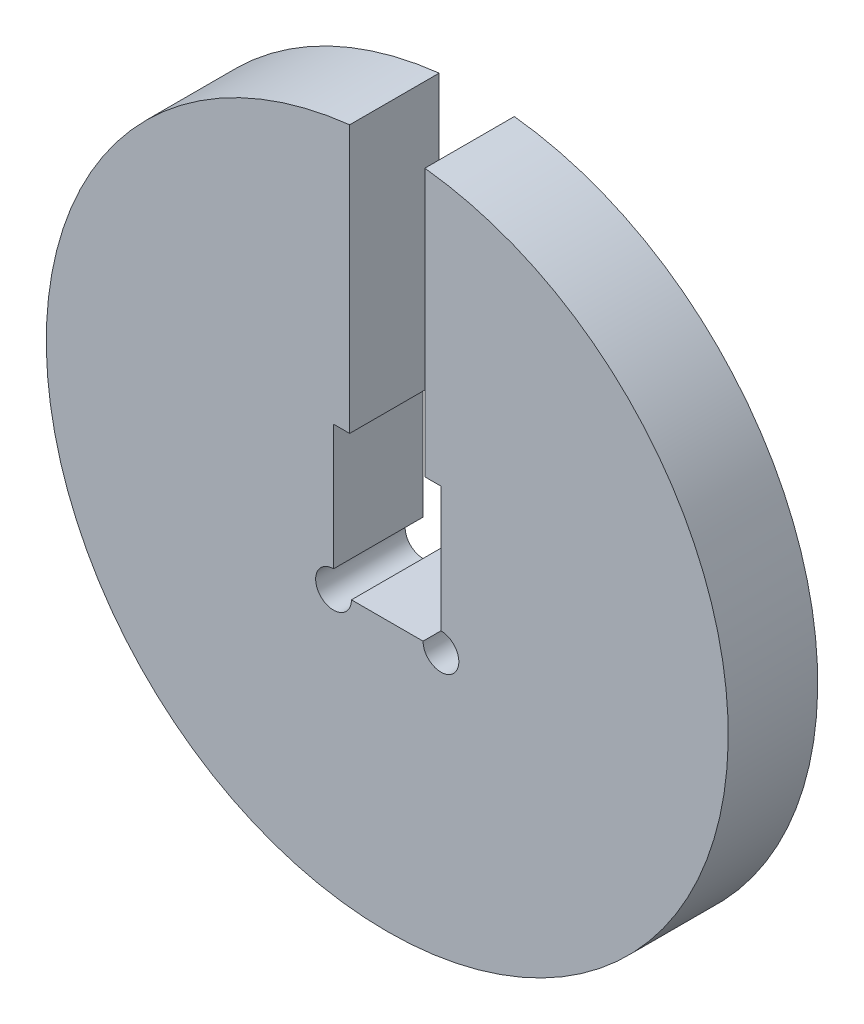
ISO-10303-21;
HEADER;
FILE_DESCRIPTION(('STEP AP214'),'2;1');
FILE_NAME('part.step','',(''),(''),'','','');
FILE_SCHEMA(('AUTOMOTIVE_DESIGN { 1 0 10303 214 1 1 1 1 }'));
ENDSEC;
DATA;
#1=APPLICATION_CONTEXT('core data for automotive mechanical design processes');
#2=APPLICATION_PROTOCOL_DEFINITION('international standard','automotive_design',2000,#1);
#3=PRODUCT_CONTEXT('',#1,'mechanical');
#4=PRODUCT('Part','Part','',(#3));
#5=PRODUCT_RELATED_PRODUCT_CATEGORY('part','',(#4));
#6=PRODUCT_DEFINITION_FORMATION('','',#4);
#7=PRODUCT_DEFINITION_CONTEXT('part definition',#1,'design');
#8=PRODUCT_DEFINITION('design','',#6,#7);
#9=PRODUCT_DEFINITION_SHAPE('','',#8);
#10=(LENGTH_UNIT() NAMED_UNIT(*) SI_UNIT(.MILLI.,.METRE.));
#11=(NAMED_UNIT(*) PLANE_ANGLE_UNIT() SI_UNIT($,.RADIAN.));
#12=(NAMED_UNIT(*) SI_UNIT($,.STERADIAN.) SOLID_ANGLE_UNIT());
#13=UNCERTAINTY_MEASURE_WITH_UNIT(LENGTH_MEASURE(1.E-05),#10,'distance_accuracy_value','');
#14=(GEOMETRIC_REPRESENTATION_CONTEXT(3) GLOBAL_UNCERTAINTY_ASSIGNED_CONTEXT((#13)) GLOBAL_UNIT_ASSIGNED_CONTEXT((#10,
#11,#12)) REPRESENTATION_CONTEXT('',''));
#15=CARTESIAN_POINT('',(0.,0.,0.));
#16=DIRECTION('',(0.,0.,1.));
#17=DIRECTION('',(1.,0.,0.));
#18=AXIS2_PLACEMENT_3D('',#15,#16,#17);
#19=CARTESIAN_POINT('',(-1.5,2.,2.5));
#20=DIRECTION('',(0.,-1.,0.));
#21=DIRECTION('',(0.,0.,-1.));
#22=AXIS2_PLACEMENT_3D('',#19,#20,#21);
#23=PLANE('',#22);
#24=DIRECTION('',(0.,0.,1.));
#25=VECTOR('',#24,1.);
#26=CARTESIAN_POINT('',(-1.05,2.,0.));
#27=LINE('',#26,#25);
#28=CARTESIAN_POINT('',(-1.05,2.,0.));
#29=VERTEX_POINT('',#28);
#30=CARTESIAN_POINT('',(-1.05,2.,2.5));
#31=VERTEX_POINT('',#30);
#32=EDGE_CURVE('E178',#29,#31,#27,.T.);
#33=ORIENTED_EDGE('',*,*,#32,.T.);
#34=DIRECTION('',(-1.,0.,0.));
#35=VECTOR('',#34,1.);
#36=CARTESIAN_POINT('',(-1.5,2.,2.5));
#37=LINE('',#36,#35);
#38=CARTESIAN_POINT('',(-1.5,2.,2.5));
#39=VERTEX_POINT('',#38);
#40=EDGE_CURVE('E126',#31,#39,#37,.T.);
#41=ORIENTED_EDGE('',*,*,#40,.T.);
#42=DIRECTION('',(0.,0.,-1.));
#43=VECTOR('',#42,1.);
#44=CARTESIAN_POINT('',(-1.5,2.,2.5));
#45=LINE('',#44,#43);
#46=CARTESIAN_POINT('',(-1.5,2.,0.));
#47=VERTEX_POINT('',#46);
#48=EDGE_CURVE('E136',#39,#47,#45,.T.);
#49=ORIENTED_EDGE('',*,*,#48,.T.);
#50=DIRECTION('',(-1.,0.,0.));
#51=VECTOR('',#50,1.);
#52=CARTESIAN_POINT('',(-1.5,2.,0.));
#53=LINE('',#52,#51);
#54=EDGE_CURVE('E145',#29,#47,#53,.T.);
#55=ORIENTED_EDGE('',*,*,#54,.F.);
#56=EDGE_LOOP('',(#33,#41,#49,#55));
#57=FACE_BOUND('',#56,.T.);
#58=ADVANCED_FACE('F32',(#57),#23,.T.);
#59=CARTESIAN_POINT('',(0.,0.,2.5));
#60=DIRECTION('',(0.,0.,1.));
#61=DIRECTION('',(1.,0.,0.));
#62=AXIS2_PLACEMENT_3D('',#59,#60,#61);
#63=PLANE('',#62);
#64=CARTESIAN_POINT('',(1.5,-2.,2.5));
#65=DIRECTION('',(0.,0.,1.));
#66=DIRECTION('',(1.,0.,0.));
#67=AXIS2_PLACEMENT_3D('',#64,#65,#66);
#68=CIRCLE('',#67,0.5);
#69=CARTESIAN_POINT('',(1.,-2.,2.5));
#70=VERTEX_POINT('',#69);
#71=CARTESIAN_POINT('',(1.5,-1.5,2.5));
#72=VERTEX_POINT('',#71);
#73=EDGE_CURVE('E46',#70,#72,#68,.T.);
#74=ORIENTED_EDGE('',*,*,#73,.F.);
#75=DIRECTION('',(1.,0.,0.));
#76=VECTOR('',#75,1.);
#77=CARTESIAN_POINT('',(-1.5,-2.,2.5));
#78=LINE('',#77,#76);
#79=CARTESIAN_POINT('',(-1.,-2.,2.5));
#80=VERTEX_POINT('',#79);
#81=EDGE_CURVE('E119',#80,#70,#78,.T.);
#82=ORIENTED_EDGE('',*,*,#81,.F.);
#83=CARTESIAN_POINT('',(-1.5,-2.,2.5));
#84=DIRECTION('',(0.,0.,1.));
#85=DIRECTION('',(1.,0.,0.));
#86=AXIS2_PLACEMENT_3D('',#83,#84,#85);
#87=CIRCLE('',#86,0.5);
#88=CARTESIAN_POINT('',(-1.5,-1.5,2.5));
#89=VERTEX_POINT('',#88);
#90=EDGE_CURVE('E54',#89,#80,#87,.T.);
#91=ORIENTED_EDGE('',*,*,#90,.F.);
#92=DIRECTION('',(0.,-1.,0.));
#93=VECTOR('',#92,1.);
#94=CARTESIAN_POINT('',(-1.5,2.,2.5));
#95=LINE('',#94,#93);
#96=EDGE_CURVE('E124',#39,#89,#95,.T.);
#97=ORIENTED_EDGE('',*,*,#96,.F.);
#98=ORIENTED_EDGE('',*,*,#40,.F.);
#99=DIRECTION('',(0.,-1.,0.));
#100=VECTOR('',#99,1.);
#101=CARTESIAN_POINT('',(-1.05,2.,2.5));
#102=LINE('',#101,#100);
#103=CARTESIAN_POINT('',(-1.05,9.46694908616287,2.5));
#104=VERTEX_POINT('',#103);
#105=EDGE_CURVE('E167',#104,#31,#102,.T.);
#106=ORIENTED_EDGE('',*,*,#105,.F.);
#107=CARTESIAN_POINT('',(0.,0.,2.5));
#108=DIRECTION('',(0.,0.,1.));
#109=DIRECTION('',(1.,0.,0.));
#110=AXIS2_PLACEMENT_3D('',#107,#108,#109);
#111=CIRCLE('',#110,9.525);
#112=CARTESIAN_POINT('',(1.05,9.46694908616287,2.5));
#113=VERTEX_POINT('',#112);
#114=EDGE_CURVE('E154',#104,#113,#111,.T.);
#115=ORIENTED_EDGE('',*,*,#114,.T.);
#116=DIRECTION('',(0.,1.,0.));
#117=VECTOR('',#116,1.);
#118=CARTESIAN_POINT('',(1.05,2.,2.5));
#119=LINE('',#118,#117);
#120=CARTESIAN_POINT('',(1.05,2.,2.5));
#121=VERTEX_POINT('',#120);
#122=EDGE_CURVE('E175',#121,#113,#119,.T.);
#123=ORIENTED_EDGE('',*,*,#122,.F.);
#124=CARTESIAN_POINT('',(1.5,2.,2.5));
#125=VERTEX_POINT('',#124);
#126=EDGE_CURVE('E133',#125,#121,#37,.T.);
#127=ORIENTED_EDGE('',*,*,#126,.F.);
#128=DIRECTION('',(0.,1.,0.));
#129=VECTOR('',#128,1.);
#130=CARTESIAN_POINT('',(1.5,2.,2.5));
#131=LINE('',#130,#129);
#132=EDGE_CURVE('E121',#72,#125,#131,.T.);
#133=ORIENTED_EDGE('',*,*,#132,.F.);
#134=EDGE_LOOP('',(#74,#82,#91,#97,#98,#106,#115,#123,#127,#133));
#135=FACE_BOUND('',#134,.T.);
#136=ADVANCED_FACE('F118',(#135),#63,.T.);
#137=CARTESIAN_POINT('',(0.,0.,0.));
#138=DIRECTION('',(0.,0.,1.));
#139=DIRECTION('',(1.,0.,0.));
#140=AXIS2_PLACEMENT_3D('',#137,#138,#139);
#141=PLANE('',#140);
#142=DIRECTION('',(1.,0.,0.));
#143=VECTOR('',#142,1.);
#144=CARTESIAN_POINT('',(-1.5,-2.,0.));
#145=LINE('',#144,#143);
#146=CARTESIAN_POINT('',(-1.,-2.,0.));
#147=VERTEX_POINT('',#146);
#148=CARTESIAN_POINT('',(1.,-2.,0.));
#149=VERTEX_POINT('',#148);
#150=EDGE_CURVE('E140',#147,#149,#145,.T.);
#151=ORIENTED_EDGE('',*,*,#150,.T.);
#152=CARTESIAN_POINT('',(1.5,-2.,0.));
#153=DIRECTION('',(0.,0.,1.));
#154=DIRECTION('',(1.,0.,0.));
#155=AXIS2_PLACEMENT_3D('',#152,#153,#154);
#156=CIRCLE('',#155,0.5);
#157=CARTESIAN_POINT('',(1.5,-1.5,0.));
#158=VERTEX_POINT('',#157);
#159=EDGE_CURVE('E109',#149,#158,#156,.T.);
#160=ORIENTED_EDGE('',*,*,#159,.T.);
#161=DIRECTION('',(0.,1.,0.));
#162=VECTOR('',#161,1.);
#163=CARTESIAN_POINT('',(1.5,2.,0.));
#164=LINE('',#163,#162);
#165=CARTESIAN_POINT('',(1.5,2.,0.));
#166=VERTEX_POINT('',#165);
#167=EDGE_CURVE('E143',#158,#166,#164,.T.);
#168=ORIENTED_EDGE('',*,*,#167,.T.);
#169=CARTESIAN_POINT('',(1.05,2.,0.));
#170=VERTEX_POINT('',#169);
#171=EDGE_CURVE('E129',#166,#170,#53,.T.);
#172=ORIENTED_EDGE('',*,*,#171,.T.);
#173=DIRECTION('',(0.,1.,0.));
#174=VECTOR('',#173,1.);
#175=CARTESIAN_POINT('',(1.05,2.,0.));
#176=LINE('',#175,#174);
#177=CARTESIAN_POINT('',(1.05,9.46694908616287,0.));
#178=VERTEX_POINT('',#177);
#179=EDGE_CURVE('E174',#170,#178,#176,.T.);
#180=ORIENTED_EDGE('',*,*,#179,.T.);
#181=CARTESIAN_POINT('',(0.,0.,0.));
#182=DIRECTION('',(0.,0.,1.));
#183=DIRECTION('',(1.,0.,0.));
#184=AXIS2_PLACEMENT_3D('',#181,#182,#183);
#185=CIRCLE('',#184,9.525);
#186=CARTESIAN_POINT('',(-1.05,9.46694908616287,0.));
#187=VERTEX_POINT('',#186);
#188=EDGE_CURVE('E153',#187,#178,#185,.T.);
#189=ORIENTED_EDGE('',*,*,#188,.F.);
#190=DIRECTION('',(0.,-1.,0.));
#191=VECTOR('',#190,1.);
#192=CARTESIAN_POINT('',(-1.05,2.,0.));
#193=LINE('',#192,#191);
#194=EDGE_CURVE('E171',#187,#29,#193,.T.);
#195=ORIENTED_EDGE('',*,*,#194,.T.);
#196=ORIENTED_EDGE('',*,*,#54,.T.);
#197=DIRECTION('',(0.,-1.,0.));
#198=VECTOR('',#197,1.);
#199=CARTESIAN_POINT('',(-1.5,2.,0.));
#200=LINE('',#199,#198);
#201=CARTESIAN_POINT('',(-1.5,-1.5,0.));
#202=VERTEX_POINT('',#201);
#203=EDGE_CURVE('E137',#47,#202,#200,.T.);
#204=ORIENTED_EDGE('',*,*,#203,.T.);
#205=CARTESIAN_POINT('',(-1.5,-2.,0.));
#206=DIRECTION('',(0.,0.,1.));
#207=DIRECTION('',(1.,0.,0.));
#208=AXIS2_PLACEMENT_3D('',#205,#206,#207);
#209=CIRCLE('',#208,0.5);
#210=EDGE_CURVE('E160',#202,#147,#209,.T.);
#211=ORIENTED_EDGE('',*,*,#210,.T.);
#212=EDGE_LOOP('',(#151,#160,#168,#172,#180,#189,#195,#196,#204,#211));
#213=FACE_BOUND('',#212,.T.);
#214=ADVANCED_FACE('F163',(#213),#141,.F.);
#215=CARTESIAN_POINT('',(0.,0.,2.5));
#216=DIRECTION('',(0.,0.,-1.));
#217=DIRECTION('',(-1.,0.,0.));
#218=AXIS2_PLACEMENT_3D('',#215,#216,#217);
#219=CYLINDRICAL_SURFACE('',#218,9.525);
#220=ORIENTED_EDGE('',*,*,#114,.F.);
#221=DIRECTION('',(0.,0.,-1.));
#222=VECTOR('',#221,1.);
#223=CARTESIAN_POINT('',(-1.05,9.46694908616287,2.5));
#224=LINE('',#223,#222);
#225=EDGE_CURVE('E141',#104,#187,#224,.T.);
#226=ORIENTED_EDGE('',*,*,#225,.T.);
#227=ORIENTED_EDGE('',*,*,#188,.T.);
#228=DIRECTION('',(0.,0.,-1.));
#229=VECTOR('',#228,1.);
#230=CARTESIAN_POINT('',(1.05,9.46694908616287,2.5));
#231=LINE('',#230,#229);
#232=EDGE_CURVE('E183',#178,#113,#231,.F.);
#233=ORIENTED_EDGE('',*,*,#232,.T.);
#234=EDGE_LOOP('',(#220,#226,#227,#233));
#235=FACE_BOUND('',#234,.T.);
#236=ADVANCED_FACE('F34',(#235),#219,.T.);
#237=CARTESIAN_POINT('',(-1.5,2.,2.5));
#238=DIRECTION('',(1.,0.,0.));
#239=DIRECTION('',(0.,1.,0.));
#240=AXIS2_PLACEMENT_3D('',#237,#238,#239);
#241=PLANE('',#240);
#242=DIRECTION('',(0.,0.,1.));
#243=VECTOR('',#242,1.);
#244=CARTESIAN_POINT('',(-1.5,-1.5,0.));
#245=LINE('',#244,#243);
#246=EDGE_CURVE('E165',#202,#89,#245,.T.);
#247=ORIENTED_EDGE('',*,*,#246,.F.);
#248=ORIENTED_EDGE('',*,*,#203,.F.);
#249=ORIENTED_EDGE('',*,*,#48,.F.);
#250=ORIENTED_EDGE('',*,*,#96,.T.);
#251=EDGE_LOOP('',(#247,#248,#249,#250));
#252=FACE_BOUND('',#251,.T.);
#253=ADVANCED_FACE('F208',(#252),#241,.T.);
#254=CARTESIAN_POINT('',(-1.5,-2.,2.5));
#255=DIRECTION('',(0.,1.,0.));
#256=DIRECTION('',(-1.,0.,0.));
#257=AXIS2_PLACEMENT_3D('',#254,#255,#256);
#258=PLANE('',#257);
#259=DIRECTION('',(0.,0.,1.));
#260=VECTOR('',#259,1.);
#261=CARTESIAN_POINT('',(1.,-2.,0.));
#262=LINE('',#261,#260);
#263=EDGE_CURVE('E106',#149,#70,#262,.T.);
#264=ORIENTED_EDGE('',*,*,#263,.F.);
#265=ORIENTED_EDGE('',*,*,#150,.F.);
#266=DIRECTION('',(0.,0.,1.));
#267=VECTOR('',#266,1.);
#268=CARTESIAN_POINT('',(-1.,-2.,0.));
#269=LINE('',#268,#267);
#270=EDGE_CURVE('E40',#80,#147,#269,.F.);
#271=ORIENTED_EDGE('',*,*,#270,.F.);
#272=ORIENTED_EDGE('',*,*,#81,.T.);
#273=EDGE_LOOP('',(#264,#265,#271,#272));
#274=FACE_BOUND('',#273,.T.);
#275=ADVANCED_FACE('F123',(#274),#258,.T.);
#276=CARTESIAN_POINT('',(1.5,2.,2.5));
#277=DIRECTION('',(-1.,0.,0.));
#278=DIRECTION('',(0.,0.,1.));
#279=AXIS2_PLACEMENT_3D('',#276,#277,#278);
#280=PLANE('',#279);
#281=DIRECTION('',(0.,0.,1.));
#282=VECTOR('',#281,1.);
#283=CARTESIAN_POINT('',(1.5,-1.5,0.));
#284=LINE('',#283,#282);
#285=EDGE_CURVE('E11',#72,#158,#284,.F.);
#286=ORIENTED_EDGE('',*,*,#285,.F.);
#287=ORIENTED_EDGE('',*,*,#132,.T.);
#288=DIRECTION('',(0.,0.,-1.));
#289=VECTOR('',#288,1.);
#290=CARTESIAN_POINT('',(1.5,2.,2.5));
#291=LINE('',#290,#289);
#292=EDGE_CURVE('E150',#125,#166,#291,.T.);
#293=ORIENTED_EDGE('',*,*,#292,.T.);
#294=ORIENTED_EDGE('',*,*,#167,.F.);
#295=EDGE_LOOP('',(#286,#287,#293,#294));
#296=FACE_BOUND('',#295,.T.);
#297=ADVANCED_FACE('F215',(#296),#280,.T.);
#298=DIRECTION('',(0.,0.,1.));
#299=VECTOR('',#298,1.);
#300=CARTESIAN_POINT('',(1.05,2.,0.));
#301=LINE('',#300,#299);
#302=EDGE_CURVE('E181',#170,#121,#301,.T.);
#303=ORIENTED_EDGE('',*,*,#302,.F.);
#304=ORIENTED_EDGE('',*,*,#171,.F.);
#305=ORIENTED_EDGE('',*,*,#292,.F.);
#306=ORIENTED_EDGE('',*,*,#126,.T.);
#307=EDGE_LOOP('',(#303,#304,#305,#306));
#308=FACE_BOUND('',#307,.T.);
#309=ADVANCED_FACE('F200',(#308),#23,.T.);
#310=CARTESIAN_POINT('',(1.05,2.,0.));
#311=DIRECTION('',(1.,0.,0.));
#312=DIRECTION('',(0.,1.,0.));
#313=AXIS2_PLACEMENT_3D('',#310,#311,#312);
#314=PLANE('',#313);
#315=ORIENTED_EDGE('',*,*,#179,.F.);
#316=ORIENTED_EDGE('',*,*,#302,.T.);
#317=ORIENTED_EDGE('',*,*,#122,.T.);
#318=ORIENTED_EDGE('',*,*,#232,.F.);
#319=EDGE_LOOP('',(#315,#316,#317,#318));
#320=FACE_BOUND('',#319,.T.);
#321=ADVANCED_FACE('F197',(#320),#314,.F.);
#322=CARTESIAN_POINT('',(-1.05,2.,0.));
#323=DIRECTION('',(-1.,0.,0.));
#324=DIRECTION('',(0.,0.,1.));
#325=AXIS2_PLACEMENT_3D('',#322,#323,#324);
#326=PLANE('',#325);
#327=ORIENTED_EDGE('',*,*,#105,.T.);
#328=ORIENTED_EDGE('',*,*,#32,.F.);
#329=ORIENTED_EDGE('',*,*,#194,.F.);
#330=ORIENTED_EDGE('',*,*,#225,.F.);
#331=EDGE_LOOP('',(#327,#328,#329,#330));
#332=FACE_BOUND('',#331,.T.);
#333=ADVANCED_FACE('F204',(#332),#326,.F.);
#334=CARTESIAN_POINT('',(-1.5,-2.,0.));
#335=DIRECTION('',(0.,0.,1.));
#336=DIRECTION('',(1.,0.,0.));
#337=AXIS2_PLACEMENT_3D('',#334,#335,#336);
#338=CYLINDRICAL_SURFACE('',#337,0.5);
#339=ORIENTED_EDGE('',*,*,#246,.T.);
#340=ORIENTED_EDGE('',*,*,#90,.T.);
#341=ORIENTED_EDGE('',*,*,#270,.T.);
#342=ORIENTED_EDGE('',*,*,#210,.F.);
#343=EDGE_LOOP('',(#339,#340,#341,#342));
#344=FACE_BOUND('',#343,.T.);
#345=ADVANCED_FACE('F159',(#344),#338,.F.);
#346=CARTESIAN_POINT('',(1.5,-2.,0.));
#347=DIRECTION('',(0.,0.,1.));
#348=DIRECTION('',(1.,0.,0.));
#349=AXIS2_PLACEMENT_3D('',#346,#347,#348);
#350=CYLINDRICAL_SURFACE('',#349,0.5);
#351=ORIENTED_EDGE('',*,*,#263,.T.);
#352=ORIENTED_EDGE('',*,*,#73,.T.);
#353=ORIENTED_EDGE('',*,*,#285,.T.);
#354=ORIENTED_EDGE('',*,*,#159,.F.);
#355=EDGE_LOOP('',(#351,#352,#353,#354));
#356=FACE_BOUND('',#355,.T.);
#357=ADVANCED_FACE('F107',(#356),#350,.F.);
#358=CLOSED_SHELL('',(#58,#136,#214,#236,#253,#275,#297,#309,#321,#333,#345,#357));
#359=MANIFOLD_SOLID_BREP('B2',#358);
#360=ADVANCED_BREP_SHAPE_REPRESENTATION('',(#18,#359),#14);
#361=SHAPE_DEFINITION_REPRESENTATION(#9,#360);
ENDSEC;
END-ISO-10303-21;
